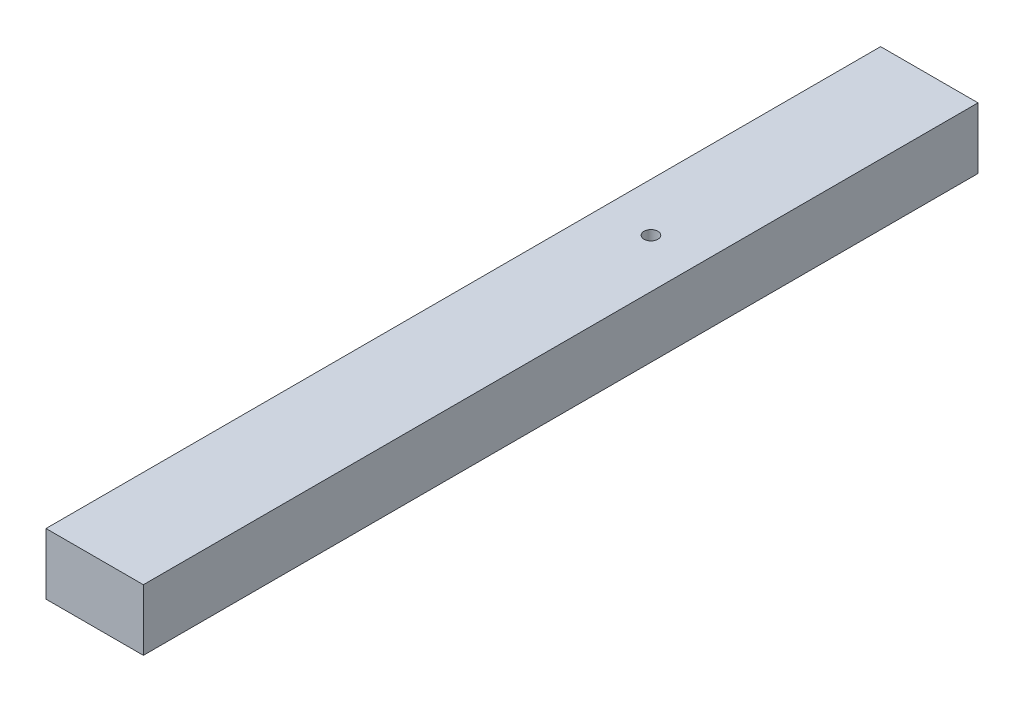
ISO-10303-21;
HEADER;
FILE_DESCRIPTION(('STEP AP214'),'2;1');
FILE_NAME('part.step','',(''),(''),'','','');
FILE_SCHEMA(('AUTOMOTIVE_DESIGN { 1 0 10303 214 1 1 1 1 }'));
ENDSEC;
DATA;
#1=APPLICATION_CONTEXT('core data for automotive mechanical design processes');
#2=APPLICATION_PROTOCOL_DEFINITION('international standard','automotive_design',2000,#1);
#3=PRODUCT_CONTEXT('',#1,'mechanical');
#4=PRODUCT('Part','Part','',(#3));
#5=PRODUCT_RELATED_PRODUCT_CATEGORY('part','',(#4));
#6=PRODUCT_DEFINITION_FORMATION('','',#4);
#7=PRODUCT_DEFINITION_CONTEXT('part definition',#1,'design');
#8=PRODUCT_DEFINITION('design','',#6,#7);
#9=PRODUCT_DEFINITION_SHAPE('','',#8);
#10=(LENGTH_UNIT() NAMED_UNIT(*) SI_UNIT(.MILLI.,.METRE.));
#11=(NAMED_UNIT(*) PLANE_ANGLE_UNIT() SI_UNIT($,.RADIAN.));
#12=(NAMED_UNIT(*) SI_UNIT($,.STERADIAN.) SOLID_ANGLE_UNIT());
#13=UNCERTAINTY_MEASURE_WITH_UNIT(LENGTH_MEASURE(1.E-05),#10,'distance_accuracy_value','');
#14=(GEOMETRIC_REPRESENTATION_CONTEXT(3) GLOBAL_UNCERTAINTY_ASSIGNED_CONTEXT((#13)) GLOBAL_UNIT_ASSIGNED_CONTEXT((#10,
#11,#12)) REPRESENTATION_CONTEXT('',''));
#15=CARTESIAN_POINT('',(0.,0.,0.));
#16=DIRECTION('',(0.,0.,1.));
#17=DIRECTION('',(1.,0.,0.));
#18=AXIS2_PLACEMENT_3D('',#15,#16,#17);
#19=CARTESIAN_POINT('',(0.,0.,600.));
#20=DIRECTION('',(1.,0.,0.));
#21=DIRECTION('',(0.,1.,0.));
#22=AXIS2_PLACEMENT_3D('',#19,#20,#21);
#23=PLANE('',#22);
#24=DIRECTION('',(0.,-1.,0.));
#25=VECTOR('',#24,1.);
#26=CARTESIAN_POINT('',(0.,0.,0.));
#27=LINE('',#26,#25);
#28=CARTESIAN_POINT('',(0.,44.,0.));
#29=VERTEX_POINT('',#28);
#30=CARTESIAN_POINT('',(0.,0.,0.));
#31=VERTEX_POINT('',#30);
#32=EDGE_CURVE('E74',#29,#31,#27,.T.);
#33=ORIENTED_EDGE('',*,*,#32,.T.);
#34=DIRECTION('',(0.,0.,-1.));
#35=VECTOR('',#34,1.);
#36=CARTESIAN_POINT('',(0.,0.,600.));
#37=LINE('',#36,#35);
#38=CARTESIAN_POINT('',(0.,0.,600.));
#39=VERTEX_POINT('',#38);
#40=EDGE_CURVE('E11',#39,#31,#37,.T.);
#41=ORIENTED_EDGE('',*,*,#40,.F.);
#42=DIRECTION('',(0.,-1.,0.));
#43=VECTOR('',#42,1.);
#44=CARTESIAN_POINT('',(0.,0.,600.));
#45=LINE('',#44,#43);
#46=CARTESIAN_POINT('',(0.,44.,600.));
#47=VERTEX_POINT('',#46);
#48=EDGE_CURVE('E97',#47,#39,#45,.T.);
#49=ORIENTED_EDGE('',*,*,#48,.F.);
#50=DIRECTION('',(0.,0.,-1.));
#51=VECTOR('',#50,1.);
#52=CARTESIAN_POINT('',(0.,44.,600.));
#53=LINE('',#52,#51);
#54=EDGE_CURVE('E86',#47,#29,#53,.T.);
#55=ORIENTED_EDGE('',*,*,#54,.T.);
#56=EDGE_LOOP('',(#33,#41,#49,#55));
#57=FACE_BOUND('',#56,.T.);
#58=ADVANCED_FACE('F30',(#57),#23,.F.);
#59=CARTESIAN_POINT('',(0.,0.,600.));
#60=DIRECTION('',(0.,1.,0.));
#61=DIRECTION('',(0.,0.,1.));
#62=AXIS2_PLACEMENT_3D('',#59,#60,#61);
#63=PLANE('',#62);
#64=CARTESIAN_POINT('',(34.8920167104661,0.,200.));
#65=DIRECTION('',(0.,1.,0.));
#66=DIRECTION('',(0.,0.,1.));
#67=AXIS2_PLACEMENT_3D('',#64,#65,#66);
#68=CIRCLE('',#67,5.);
#69=CARTESIAN_POINT('',(34.8920167104661,0.,205.));
#70=VERTEX_POINT('',#69);
#71=EDGE_CURVE('E87',#70,#70,#68,.F.);
#72=ORIENTED_EDGE('',*,*,#71,.F.);
#73=EDGE_LOOP('',(#72));
#74=FACE_BOUND('',#73,.T.);
#75=DIRECTION('',(1.,0.,0.));
#76=VECTOR('',#75,1.);
#77=CARTESIAN_POINT('',(0.,0.,0.));
#78=LINE('',#77,#76);
#79=CARTESIAN_POINT('',(70.,0.,0.));
#80=VERTEX_POINT('',#79);
#81=EDGE_CURVE('E70',#31,#80,#78,.T.);
#82=ORIENTED_EDGE('',*,*,#81,.T.);
#83=DIRECTION('',(0.,0.,-1.));
#84=VECTOR('',#83,1.);
#85=CARTESIAN_POINT('',(70.,0.,600.));
#86=LINE('',#85,#84);
#87=CARTESIAN_POINT('',(70.,0.,600.));
#88=VERTEX_POINT('',#87);
#89=EDGE_CURVE('E37',#88,#80,#86,.T.);
#90=ORIENTED_EDGE('',*,*,#89,.F.);
#91=DIRECTION('',(1.,0.,0.));
#92=VECTOR('',#91,1.);
#93=CARTESIAN_POINT('',(0.,0.,600.));
#94=LINE('',#93,#92);
#95=EDGE_CURVE('E82',#39,#88,#94,.T.);
#96=ORIENTED_EDGE('',*,*,#95,.F.);
#97=ORIENTED_EDGE('',*,*,#40,.T.);
#98=EDGE_LOOP('',(#82,#90,#96,#97));
#99=FACE_BOUND('',#98,.T.);
#100=ADVANCED_FACE('F81',(#74,#99),#63,.F.);
#101=CARTESIAN_POINT('',(70.,0.,600.));
#102=DIRECTION('',(-1.,0.,0.));
#103=DIRECTION('',(0.,-1.,0.));
#104=AXIS2_PLACEMENT_3D('',#101,#102,#103);
#105=PLANE('',#104);
#106=DIRECTION('',(0.,1.,0.));
#107=VECTOR('',#106,1.);
#108=CARTESIAN_POINT('',(70.,0.,0.));
#109=LINE('',#108,#107);
#110=CARTESIAN_POINT('',(70.,44.,0.));
#111=VERTEX_POINT('',#110);
#112=EDGE_CURVE('E75',#80,#111,#109,.T.);
#113=ORIENTED_EDGE('',*,*,#112,.T.);
#114=DIRECTION('',(0.,0.,-1.));
#115=VECTOR('',#114,1.);
#116=CARTESIAN_POINT('',(70.,44.,600.));
#117=LINE('',#116,#115);
#118=CARTESIAN_POINT('',(70.,44.,600.));
#119=VERTEX_POINT('',#118);
#120=EDGE_CURVE('E103',#119,#111,#117,.T.);
#121=ORIENTED_EDGE('',*,*,#120,.F.);
#122=DIRECTION('',(0.,1.,0.));
#123=VECTOR('',#122,1.);
#124=CARTESIAN_POINT('',(70.,0.,600.));
#125=LINE('',#124,#123);
#126=EDGE_CURVE('E49',#88,#119,#125,.T.);
#127=ORIENTED_EDGE('',*,*,#126,.F.);
#128=ORIENTED_EDGE('',*,*,#89,.T.);
#129=EDGE_LOOP('',(#113,#121,#127,#128));
#130=FACE_BOUND('',#129,.T.);
#131=ADVANCED_FACE('F106',(#130),#105,.F.);
#132=CARTESIAN_POINT('',(0.,44.,600.));
#133=DIRECTION('',(0.,-1.,0.));
#134=DIRECTION('',(0.,0.,-1.));
#135=AXIS2_PLACEMENT_3D('',#132,#133,#134);
#136=PLANE('',#135);
#137=CARTESIAN_POINT('',(34.8920167104661,44.,200.));
#138=DIRECTION('',(0.,1.,0.));
#139=DIRECTION('',(0.,0.,1.));
#140=AXIS2_PLACEMENT_3D('',#137,#138,#139);
#141=CIRCLE('',#140,5.);
#142=CARTESIAN_POINT('',(34.8920167104661,44.,205.));
#143=VERTEX_POINT('',#142);
#144=EDGE_CURVE('E90',#143,#143,#141,.T.);
#145=ORIENTED_EDGE('',*,*,#144,.F.);
#146=EDGE_LOOP('',(#145));
#147=FACE_BOUND('',#146,.T.);
#148=DIRECTION('',(-1.,0.,0.));
#149=VECTOR('',#148,1.);
#150=CARTESIAN_POINT('',(0.,44.,0.));
#151=LINE('',#150,#149);
#152=EDGE_CURVE('E95',#111,#29,#151,.T.);
#153=ORIENTED_EDGE('',*,*,#152,.T.);
#154=ORIENTED_EDGE('',*,*,#54,.F.);
#155=DIRECTION('',(-1.,0.,0.));
#156=VECTOR('',#155,1.);
#157=CARTESIAN_POINT('',(0.,44.,600.));
#158=LINE('',#157,#156);
#159=EDGE_CURVE('E44',#119,#47,#158,.T.);
#160=ORIENTED_EDGE('',*,*,#159,.F.);
#161=ORIENTED_EDGE('',*,*,#120,.T.);
#162=EDGE_LOOP('',(#153,#154,#160,#161));
#163=FACE_BOUND('',#162,.T.);
#164=ADVANCED_FACE('F108',(#147,#163),#136,.F.);
#165=CARTESIAN_POINT('',(0.,44.,600.));
#166=DIRECTION('',(0.,0.,-1.));
#167=DIRECTION('',(-1.,0.,0.));
#168=AXIS2_PLACEMENT_3D('',#165,#166,#167);
#169=PLANE('',#168);
#170=ORIENTED_EDGE('',*,*,#48,.T.);
#171=ORIENTED_EDGE('',*,*,#95,.T.);
#172=ORIENTED_EDGE('',*,*,#126,.T.);
#173=ORIENTED_EDGE('',*,*,#159,.T.);
#174=EDGE_LOOP('',(#170,#171,#172,#173));
#175=FACE_BOUND('',#174,.T.);
#176=ADVANCED_FACE('F109',(#175),#169,.F.);
#177=CARTESIAN_POINT('',(0.,44.,0.));
#178=DIRECTION('',(0.,0.,-1.));
#179=DIRECTION('',(-1.,0.,0.));
#180=AXIS2_PLACEMENT_3D('',#177,#178,#179);
#181=PLANE('',#180);
#182=ORIENTED_EDGE('',*,*,#32,.F.);
#183=ORIENTED_EDGE('',*,*,#152,.F.);
#184=ORIENTED_EDGE('',*,*,#112,.F.);
#185=ORIENTED_EDGE('',*,*,#81,.F.);
#186=EDGE_LOOP('',(#182,#183,#184,#185));
#187=FACE_BOUND('',#186,.T.);
#188=ADVANCED_FACE('F71',(#187),#181,.T.);
#189=CARTESIAN_POINT('',(34.8920167104661,-0.001000000000001,200.));
#190=DIRECTION('',(0.,1.,0.));
#191=DIRECTION('',(0.,0.,1.));
#192=AXIS2_PLACEMENT_3D('',#189,#190,#191);
#193=CYLINDRICAL_SURFACE('',#192,5.);
#194=ORIENTED_EDGE('',*,*,#144,.T.);
#195=EDGE_LOOP('',(#194));
#196=FACE_BOUND('',#195,.T.);
#197=ORIENTED_EDGE('',*,*,#71,.T.);
#198=EDGE_LOOP('',(#197));
#199=FACE_BOUND('',#198,.T.);
#200=ADVANCED_FACE('F116',(#196,#199),#193,.F.);
#201=CLOSED_SHELL('',(#58,#100,#131,#164,#176,#188,#200));
#202=MANIFOLD_SOLID_BREP('B2',#201);
#203=ADVANCED_BREP_SHAPE_REPRESENTATION('',(#18,#202),#14);
#204=SHAPE_DEFINITION_REPRESENTATION(#9,#203);
ENDSEC;
END-ISO-10303-21;
